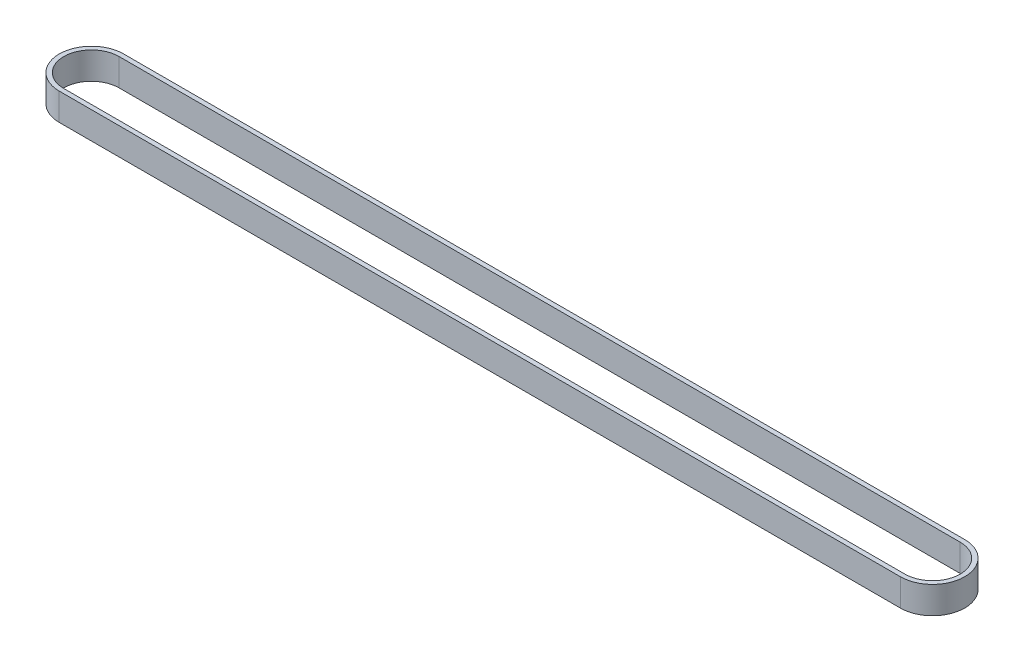
ISO-10303-21;
HEADER;
FILE_DESCRIPTION(('STEP AP214'),'2;1');
FILE_NAME('part.step','',(''),(''),'','','');
FILE_SCHEMA(('AUTOMOTIVE_DESIGN { 1 0 10303 214 1 1 1 1 }'));
ENDSEC;
DATA;
#1=APPLICATION_CONTEXT('core data for automotive mechanical design processes');
#2=APPLICATION_PROTOCOL_DEFINITION('international standard','automotive_design',2000,#1);
#3=PRODUCT_CONTEXT('',#1,'mechanical');
#4=PRODUCT('Part','Part','',(#3));
#5=PRODUCT_RELATED_PRODUCT_CATEGORY('part','',(#4));
#6=PRODUCT_DEFINITION_FORMATION('','',#4);
#7=PRODUCT_DEFINITION_CONTEXT('part definition',#1,'design');
#8=PRODUCT_DEFINITION('design','',#6,#7);
#9=PRODUCT_DEFINITION_SHAPE('','',#8);
#10=(LENGTH_UNIT() NAMED_UNIT(*) SI_UNIT(.MILLI.,.METRE.));
#11=(NAMED_UNIT(*) PLANE_ANGLE_UNIT() SI_UNIT($,.RADIAN.));
#12=(NAMED_UNIT(*) SI_UNIT($,.STERADIAN.) SOLID_ANGLE_UNIT());
#13=UNCERTAINTY_MEASURE_WITH_UNIT(LENGTH_MEASURE(1.E-05),#10,'distance_accuracy_value','');
#14=(GEOMETRIC_REPRESENTATION_CONTEXT(3) GLOBAL_UNCERTAINTY_ASSIGNED_CONTEXT((#13)) GLOBAL_UNIT_ASSIGNED_CONTEXT((#10,
#11,#12)) REPRESENTATION_CONTEXT('',''));
#15=CARTESIAN_POINT('',(0.,0.,0.));
#16=DIRECTION('',(0.,0.,1.));
#17=DIRECTION('',(1.,0.,0.));
#18=AXIS2_PLACEMENT_3D('',#15,#16,#17);
#19=CARTESIAN_POINT('',(0.,6.,0.));
#20=DIRECTION('',(0.,1.,0.));
#21=DIRECTION('',(0.,0.,1.));
#22=AXIS2_PLACEMENT_3D('',#19,#20,#21);
#23=PLANE('',#22);
#24=CARTESIAN_POINT('',(0.,6.,0.));
#25=DIRECTION('',(0.,1.,0.));
#26=DIRECTION('',(0.,0.,1.));
#27=AXIS2_PLACEMENT_3D('',#24,#25,#26);
#28=CIRCLE('',#27,7.11);
#29=CARTESIAN_POINT('',(0.,6.,-7.11));
#30=VERTEX_POINT('',#29);
#31=CARTESIAN_POINT('',(0.,6.,7.11));
#32=VERTEX_POINT('',#31);
#33=EDGE_CURVE('E161',#30,#32,#28,.T.);
#34=ORIENTED_EDGE('',*,*,#33,.T.);
#35=DIRECTION('',(1.,0.,0.));
#36=VECTOR('',#35,1.);
#37=CARTESIAN_POINT('',(0.,6.,7.11));
#38=LINE('',#37,#36);
#39=CARTESIAN_POINT('',(185.798585701,6.,7.11));
#40=VERTEX_POINT('',#39);
#41=EDGE_CURVE('E165',#32,#40,#38,.T.);
#42=ORIENTED_EDGE('',*,*,#41,.T.);
#43=CARTESIAN_POINT('',(185.798585701,6.,0.));
#44=DIRECTION('',(0.,1.,0.));
#45=DIRECTION('',(0.,0.,-1.));
#46=AXIS2_PLACEMENT_3D('',#43,#44,#45);
#47=CIRCLE('',#46,7.11);
#48=CARTESIAN_POINT('',(185.798585701,6.,-7.11));
#49=VERTEX_POINT('',#48);
#50=EDGE_CURVE('E169',#40,#49,#47,.T.);
#51=ORIENTED_EDGE('',*,*,#50,.T.);
#52=DIRECTION('',(-1.,0.,0.));
#53=VECTOR('',#52,1.);
#54=CARTESIAN_POINT('',(0.,6.,-7.11));
#55=LINE('',#54,#53);
#56=EDGE_CURVE('E172',#49,#30,#55,.T.);
#57=ORIENTED_EDGE('',*,*,#56,.T.);
#58=EDGE_LOOP('',(#34,#42,#51,#57));
#59=FACE_BOUND('',#58,.T.);
#60=DIRECTION('',(1.,0.,0.));
#61=VECTOR('',#60,1.);
#62=CARTESIAN_POINT('',(0.,6.,6.11219772367582));
#63=LINE('',#62,#61);
#64=CARTESIAN_POINT('',(0.,6.,6.11219772367582));
#65=VERTEX_POINT('',#64);
#66=CARTESIAN_POINT('',(185.798585701,6.,6.11219772367582));
#67=VERTEX_POINT('',#66);
#68=EDGE_CURVE('E122',#65,#67,#63,.T.);
#69=ORIENTED_EDGE('',*,*,#68,.F.);
#70=CARTESIAN_POINT('',(0.,6.,0.));
#71=DIRECTION('',(0.,1.,0.));
#72=DIRECTION('',(0.,0.,1.));
#73=AXIS2_PLACEMENT_3D('',#70,#71,#72);
#74=CIRCLE('',#73,6.11219772367582);
#75=CARTESIAN_POINT('',(0.,6.,-6.11219772367582));
#76=VERTEX_POINT('',#75);
#77=EDGE_CURVE('E113',#76,#65,#74,.T.);
#78=ORIENTED_EDGE('',*,*,#77,.F.);
#79=DIRECTION('',(-1.,0.,0.));
#80=VECTOR('',#79,1.);
#81=CARTESIAN_POINT('',(0.,6.,-6.11219772367582));
#82=LINE('',#81,#80);
#83=CARTESIAN_POINT('',(185.798585701,6.,-6.11219772367582));
#84=VERTEX_POINT('',#83);
#85=EDGE_CURVE('E139',#84,#76,#82,.T.);
#86=ORIENTED_EDGE('',*,*,#85,.F.);
#87=CARTESIAN_POINT('',(185.798585701,6.,0.));
#88=DIRECTION('',(0.,1.,0.));
#89=DIRECTION('',(0.,0.,1.));
#90=AXIS2_PLACEMENT_3D('',#87,#88,#89);
#91=CIRCLE('',#90,6.11219772367582);
#92=EDGE_CURVE('E135',#67,#84,#91,.T.);
#93=ORIENTED_EDGE('',*,*,#92,.F.);
#94=EDGE_LOOP('',(#69,#78,#86,#93));
#95=FACE_BOUND('',#94,.T.);
#96=ADVANCED_FACE('F47',(#59,#95),#23,.T.);
#97=CARTESIAN_POINT('',(0.,0.,0.));
#98=DIRECTION('',(0.,1.,0.));
#99=DIRECTION('',(0.,0.,1.));
#100=AXIS2_PLACEMENT_3D('',#97,#98,#99);
#101=PLANE('',#100);
#102=CARTESIAN_POINT('',(0.,0.,0.));
#103=DIRECTION('',(0.,1.,0.));
#104=DIRECTION('',(0.,0.,1.));
#105=AXIS2_PLACEMENT_3D('',#102,#103,#104);
#106=CIRCLE('',#105,7.11);
#107=CARTESIAN_POINT('',(0.,0.,-7.11));
#108=VERTEX_POINT('',#107);
#109=CARTESIAN_POINT('',(0.,0.,7.11));
#110=VERTEX_POINT('',#109);
#111=EDGE_CURVE('E131',#108,#110,#106,.T.);
#112=ORIENTED_EDGE('',*,*,#111,.F.);
#113=DIRECTION('',(-1.,0.,0.));
#114=VECTOR('',#113,1.);
#115=CARTESIAN_POINT('',(0.,0.,-7.11));
#116=LINE('',#115,#114);
#117=CARTESIAN_POINT('',(185.798585701,0.,-7.11));
#118=VERTEX_POINT('',#117);
#119=EDGE_CURVE('E166',#118,#108,#116,.T.);
#120=ORIENTED_EDGE('',*,*,#119,.F.);
#121=CARTESIAN_POINT('',(185.798585701,0.,0.));
#122=DIRECTION('',(0.,1.,0.));
#123=DIRECTION('',(0.,0.,-1.));
#124=AXIS2_PLACEMENT_3D('',#121,#122,#123);
#125=CIRCLE('',#124,7.11);
#126=CARTESIAN_POINT('',(185.798585701,0.,7.11));
#127=VERTEX_POINT('',#126);
#128=EDGE_CURVE('E182',#127,#118,#125,.T.);
#129=ORIENTED_EDGE('',*,*,#128,.F.);
#130=DIRECTION('',(1.,0.,0.));
#131=VECTOR('',#130,1.);
#132=CARTESIAN_POINT('',(0.,0.,7.11));
#133=LINE('',#132,#131);
#134=EDGE_CURVE('E179',#110,#127,#133,.T.);
#135=ORIENTED_EDGE('',*,*,#134,.F.);
#136=EDGE_LOOP('',(#112,#120,#129,#135));
#137=FACE_BOUND('',#136,.T.);
#138=CARTESIAN_POINT('',(0.,0.,0.));
#139=DIRECTION('',(0.,1.,0.));
#140=DIRECTION('',(0.,0.,1.));
#141=AXIS2_PLACEMENT_3D('',#138,#139,#140);
#142=CIRCLE('',#141,6.11219772367582);
#143=CARTESIAN_POINT('',(0.,0.,-6.11219772367582));
#144=VERTEX_POINT('',#143);
#145=CARTESIAN_POINT('',(0.,0.,6.11219772367582));
#146=VERTEX_POINT('',#145);
#147=EDGE_CURVE('E71',#144,#146,#142,.T.);
#148=ORIENTED_EDGE('',*,*,#147,.T.);
#149=DIRECTION('',(1.,0.,0.));
#150=VECTOR('',#149,1.);
#151=CARTESIAN_POINT('',(0.,0.,6.11219772367582));
#152=LINE('',#151,#150);
#153=CARTESIAN_POINT('',(185.798585701,0.,6.11219772367582));
#154=VERTEX_POINT('',#153);
#155=EDGE_CURVE('E129',#146,#154,#152,.T.);
#156=ORIENTED_EDGE('',*,*,#155,.T.);
#157=CARTESIAN_POINT('',(185.798585701,0.,0.));
#158=DIRECTION('',(0.,1.,0.));
#159=DIRECTION('',(0.,0.,1.));
#160=AXIS2_PLACEMENT_3D('',#157,#158,#159);
#161=CIRCLE('',#160,6.11219772367582);
#162=CARTESIAN_POINT('',(185.798585701,0.,-6.11219772367582));
#163=VERTEX_POINT('',#162);
#164=EDGE_CURVE('E148',#154,#163,#161,.T.);
#165=ORIENTED_EDGE('',*,*,#164,.T.);
#166=DIRECTION('',(-1.,0.,0.));
#167=VECTOR('',#166,1.);
#168=CARTESIAN_POINT('',(0.,0.,-6.11219772367582));
#169=LINE('',#168,#167);
#170=EDGE_CURVE('E123',#163,#144,#169,.T.);
#171=ORIENTED_EDGE('',*,*,#170,.T.);
#172=EDGE_LOOP('',(#148,#156,#165,#171));
#173=FACE_BOUND('',#172,.T.);
#174=ADVANCED_FACE('F205',(#137,#173),#101,.F.);
#175=CARTESIAN_POINT('',(0.,6.,0.));
#176=DIRECTION('',(0.,-1.,0.));
#177=DIRECTION('',(0.,0.,-1.));
#178=AXIS2_PLACEMENT_3D('',#175,#176,#177);
#179=CYLINDRICAL_SURFACE('',#178,7.11);
#180=ORIENTED_EDGE('',*,*,#111,.T.);
#181=DIRECTION('',(0.,-1.,0.));
#182=VECTOR('',#181,1.);
#183=CARTESIAN_POINT('',(0.,6.,7.11));
#184=LINE('',#183,#182);
#185=EDGE_CURVE('E11',#32,#110,#184,.T.);
#186=ORIENTED_EDGE('',*,*,#185,.F.);
#187=ORIENTED_EDGE('',*,*,#33,.F.);
#188=DIRECTION('',(0.,-1.,0.));
#189=VECTOR('',#188,1.);
#190=CARTESIAN_POINT('',(0.,6.,-7.11));
#191=LINE('',#190,#189);
#192=EDGE_CURVE('E175',#30,#108,#191,.T.);
#193=ORIENTED_EDGE('',*,*,#192,.T.);
#194=EDGE_LOOP('',(#180,#186,#187,#193));
#195=FACE_BOUND('',#194,.T.);
#196=ADVANCED_FACE('F49',(#195),#179,.T.);
#197=CARTESIAN_POINT('',(0.,6.,7.11));
#198=DIRECTION('',(0.,0.,-1.));
#199=DIRECTION('',(-1.,0.,0.));
#200=AXIS2_PLACEMENT_3D('',#197,#198,#199);
#201=PLANE('',#200);
#202=ORIENTED_EDGE('',*,*,#134,.T.);
#203=DIRECTION('',(0.,-1.,0.));
#204=VECTOR('',#203,1.);
#205=CARTESIAN_POINT('',(185.798585701,6.,7.11));
#206=LINE('',#205,#204);
#207=EDGE_CURVE('E56',#40,#127,#206,.T.);
#208=ORIENTED_EDGE('',*,*,#207,.F.);
#209=ORIENTED_EDGE('',*,*,#41,.F.);
#210=ORIENTED_EDGE('',*,*,#185,.T.);
#211=EDGE_LOOP('',(#202,#208,#209,#210));
#212=FACE_BOUND('',#211,.T.);
#213=ADVANCED_FACE('F215',(#212),#201,.F.);
#214=CARTESIAN_POINT('',(185.798585701,6.,0.));
#215=DIRECTION('',(0.,-1.,0.));
#216=DIRECTION('',(0.,0.,-1.));
#217=AXIS2_PLACEMENT_3D('',#214,#215,#216);
#218=CYLINDRICAL_SURFACE('',#217,7.11);
#219=ORIENTED_EDGE('',*,*,#128,.T.);
#220=DIRECTION('',(0.,-1.,0.));
#221=VECTOR('',#220,1.);
#222=CARTESIAN_POINT('',(185.798585701,6.,-7.11));
#223=LINE('',#222,#221);
#224=EDGE_CURVE('E190',#49,#118,#223,.T.);
#225=ORIENTED_EDGE('',*,*,#224,.F.);
#226=ORIENTED_EDGE('',*,*,#50,.F.);
#227=ORIENTED_EDGE('',*,*,#207,.T.);
#228=EDGE_LOOP('',(#219,#225,#226,#227));
#229=FACE_BOUND('',#228,.T.);
#230=ADVANCED_FACE('F199',(#229),#218,.T.);
#231=CARTESIAN_POINT('',(0.,6.,-7.11));
#232=DIRECTION('',(0.,0.,1.));
#233=DIRECTION('',(1.,0.,0.));
#234=AXIS2_PLACEMENT_3D('',#231,#232,#233);
#235=PLANE('',#234);
#236=ORIENTED_EDGE('',*,*,#119,.T.);
#237=ORIENTED_EDGE('',*,*,#192,.F.);
#238=ORIENTED_EDGE('',*,*,#56,.F.);
#239=ORIENTED_EDGE('',*,*,#224,.T.);
#240=EDGE_LOOP('',(#236,#237,#238,#239));
#241=FACE_BOUND('',#240,.T.);
#242=ADVANCED_FACE('F209',(#241),#235,.F.);
#243=CARTESIAN_POINT('',(0.,6.,0.));
#244=DIRECTION('',(0.,-1.,0.));
#245=DIRECTION('',(0.,0.,-1.));
#246=AXIS2_PLACEMENT_3D('',#243,#244,#245);
#247=CYLINDRICAL_SURFACE('',#246,6.11219772367582);
#248=ORIENTED_EDGE('',*,*,#147,.F.);
#249=DIRECTION('',(0.,-1.,0.));
#250=VECTOR('',#249,1.);
#251=CARTESIAN_POINT('',(0.,6.,-6.11219772367582));
#252=LINE('',#251,#250);
#253=EDGE_CURVE('E117',#76,#144,#252,.T.);
#254=ORIENTED_EDGE('',*,*,#253,.F.);
#255=ORIENTED_EDGE('',*,*,#77,.T.);
#256=DIRECTION('',(0.,-1.,0.));
#257=VECTOR('',#256,1.);
#258=CARTESIAN_POINT('',(0.,6.,6.11219772367582));
#259=LINE('',#258,#257);
#260=EDGE_CURVE('E116',#65,#146,#259,.T.);
#261=ORIENTED_EDGE('',*,*,#260,.T.);
#262=EDGE_LOOP('',(#248,#254,#255,#261));
#263=FACE_BOUND('',#262,.T.);
#264=ADVANCED_FACE('F115',(#263),#247,.F.);
#265=CARTESIAN_POINT('',(0.,6.,6.11219772367582));
#266=DIRECTION('',(0.,0.,-1.));
#267=DIRECTION('',(-1.,0.,0.));
#268=AXIS2_PLACEMENT_3D('',#265,#266,#267);
#269=PLANE('',#268);
#270=ORIENTED_EDGE('',*,*,#155,.F.);
#271=ORIENTED_EDGE('',*,*,#260,.F.);
#272=ORIENTED_EDGE('',*,*,#68,.T.);
#273=DIRECTION('',(0.,-1.,0.));
#274=VECTOR('',#273,1.);
#275=CARTESIAN_POINT('',(185.798585701,6.,6.11219772367582));
#276=LINE('',#275,#274);
#277=EDGE_CURVE('E132',#67,#154,#276,.T.);
#278=ORIENTED_EDGE('',*,*,#277,.T.);
#279=EDGE_LOOP('',(#270,#271,#272,#278));
#280=FACE_BOUND('',#279,.T.);
#281=ADVANCED_FACE('F126',(#280),#269,.T.);
#282=CARTESIAN_POINT('',(185.798585701,6.,0.));
#283=DIRECTION('',(0.,-1.,0.));
#284=DIRECTION('',(0.,0.,-1.));
#285=AXIS2_PLACEMENT_3D('',#282,#283,#284);
#286=CYLINDRICAL_SURFACE('',#285,6.11219772367582);
#287=ORIENTED_EDGE('',*,*,#164,.F.);
#288=ORIENTED_EDGE('',*,*,#277,.F.);
#289=ORIENTED_EDGE('',*,*,#92,.T.);
#290=DIRECTION('',(0.,-1.,0.));
#291=VECTOR('',#290,1.);
#292=CARTESIAN_POINT('',(185.798585701,6.,-6.11219772367582));
#293=LINE('',#292,#291);
#294=EDGE_CURVE('E63',#84,#163,#293,.T.);
#295=ORIENTED_EDGE('',*,*,#294,.T.);
#296=EDGE_LOOP('',(#287,#288,#289,#295));
#297=FACE_BOUND('',#296,.T.);
#298=ADVANCED_FACE('F238',(#297),#286,.F.);
#299=CARTESIAN_POINT('',(0.,6.,-6.11219772367582));
#300=DIRECTION('',(0.,0.,1.));
#301=DIRECTION('',(1.,0.,0.));
#302=AXIS2_PLACEMENT_3D('',#299,#300,#301);
#303=PLANE('',#302);
#304=ORIENTED_EDGE('',*,*,#170,.F.);
#305=ORIENTED_EDGE('',*,*,#294,.F.);
#306=ORIENTED_EDGE('',*,*,#85,.T.);
#307=ORIENTED_EDGE('',*,*,#253,.T.);
#308=EDGE_LOOP('',(#304,#305,#306,#307));
#309=FACE_BOUND('',#308,.T.);
#310=ADVANCED_FACE('F242',(#309),#303,.T.);
#311=CLOSED_SHELL('',(#96,#174,#196,#213,#230,#242,#264,#281,#298,#310));
#312=MANIFOLD_SOLID_BREP('B2',#311);
#313=ADVANCED_BREP_SHAPE_REPRESENTATION('',(#18,#312),#14);
#314=SHAPE_DEFINITION_REPRESENTATION(#9,#313);
ENDSEC;
END-ISO-10303-21;
